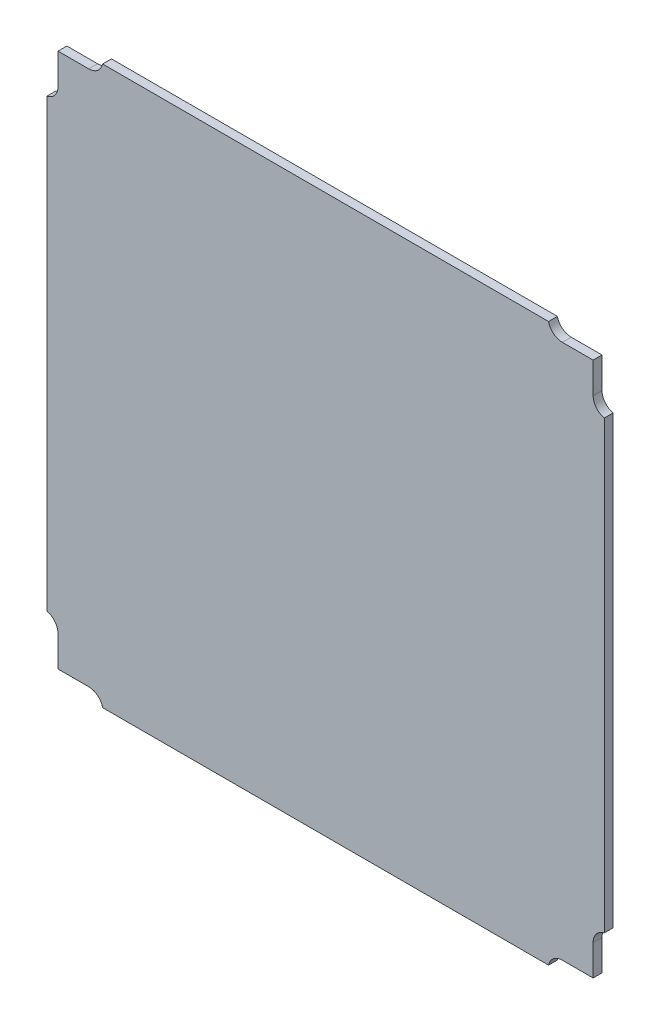
ISO-10303-21;
HEADER;
FILE_DESCRIPTION(('STEP AP214'),'2;1');
FILE_NAME('part.step','',(''),(''),'','','');
FILE_SCHEMA(('AUTOMOTIVE_DESIGN { 1 0 10303 214 1 1 1 1 }'));
ENDSEC;
DATA;
#1=APPLICATION_CONTEXT('core data for automotive mechanical design processes');
#2=APPLICATION_PROTOCOL_DEFINITION('international standard','automotive_design',2000,#1);
#3=PRODUCT_CONTEXT('',#1,'mechanical');
#4=PRODUCT('Part','Part','',(#3));
#5=PRODUCT_RELATED_PRODUCT_CATEGORY('part','',(#4));
#6=PRODUCT_DEFINITION_FORMATION('','',#4);
#7=PRODUCT_DEFINITION_CONTEXT('part definition',#1,'design');
#8=PRODUCT_DEFINITION('design','',#6,#7);
#9=PRODUCT_DEFINITION_SHAPE('','',#8);
#10=(LENGTH_UNIT() NAMED_UNIT(*) SI_UNIT(.MILLI.,.METRE.));
#11=(NAMED_UNIT(*) PLANE_ANGLE_UNIT() SI_UNIT($,.RADIAN.));
#12=(NAMED_UNIT(*) SI_UNIT($,.STERADIAN.) SOLID_ANGLE_UNIT());
#13=UNCERTAINTY_MEASURE_WITH_UNIT(LENGTH_MEASURE(1.E-05),#10,'distance_accuracy_value','');
#14=(GEOMETRIC_REPRESENTATION_CONTEXT(3) GLOBAL_UNCERTAINTY_ASSIGNED_CONTEXT((#13)) GLOBAL_UNIT_ASSIGNED_CONTEXT((#10,
#11,#12)) REPRESENTATION_CONTEXT('',''));
#15=CARTESIAN_POINT('',(0.,0.,0.));
#16=DIRECTION('',(0.,0.,1.));
#17=DIRECTION('',(1.,0.,0.));
#18=AXIS2_PLACEMENT_3D('',#15,#16,#17);
#19=CARTESIAN_POINT('',(0.,-48.0000000000001,1.5875));
#20=DIRECTION('',(0.,1.,0.));
#21=DIRECTION('',(-1.,0.,0.));
#22=AXIS2_PLACEMENT_3D('',#19,#20,#21);
#23=PLANE('',#22);
#24=DIRECTION('',(1.,0.,0.));
#25=VECTOR('',#24,1.);
#26=CARTESIAN_POINT('',(0.,-48.0000000000001,0.));
#27=LINE('',#26,#25);
#28=CARTESIAN_POINT('',(-48.,-48.,0.));
#29=VERTEX_POINT('',#28);
#30=CARTESIAN_POINT('',(-42.4819347291981,-48.,0.));
#31=VERTEX_POINT('',#30);
#32=EDGE_CURVE('E362',#29,#31,#27,.T.);
#33=ORIENTED_EDGE('',*,*,#32,.T.);
#34=DIRECTION('',(0.,0.,1.));
#35=VECTOR('',#34,1.);
#36=CARTESIAN_POINT('',(-42.4819347291981,-48.,1.5875));
#37=LINE('',#36,#35);
#38=CARTESIAN_POINT('',(-42.4819347291981,-48.,1.5875));
#39=VERTEX_POINT('',#38);
#40=EDGE_CURVE('E202',#31,#39,#37,.T.);
#41=ORIENTED_EDGE('',*,*,#40,.T.);
#42=DIRECTION('',(1.,0.,0.));
#43=VECTOR('',#42,1.);
#44=CARTESIAN_POINT('',(0.,-48.0000000000001,1.5875));
#45=LINE('',#44,#43);
#46=CARTESIAN_POINT('',(-48.,-48.,1.5875));
#47=VERTEX_POINT('',#46);
#48=EDGE_CURVE('E180',#47,#39,#45,.T.);
#49=ORIENTED_EDGE('',*,*,#48,.F.);
#50=DIRECTION('',(0.,0.,-1.));
#51=VECTOR('',#50,1.);
#52=CARTESIAN_POINT('',(-48.,-48.,1.5875));
#53=LINE('',#52,#51);
#54=EDGE_CURVE('E290',#47,#29,#53,.T.);
#55=ORIENTED_EDGE('',*,*,#54,.T.);
#56=EDGE_LOOP('',(#33,#41,#49,#55));
#57=FACE_BOUND('',#56,.T.);
#58=ADVANCED_FACE('F37',(#57),#23,.F.);
#59=CARTESIAN_POINT('',(0.,-50.,1.5875));
#60=DIRECTION('',(0.,1.,0.));
#61=DIRECTION('',(0.,0.,1.));
#62=AXIS2_PLACEMENT_3D('',#59,#60,#61);
#63=PLANE('',#62);
#64=DIRECTION('',(1.,0.,0.));
#65=VECTOR('',#64,1.);
#66=CARTESIAN_POINT('',(0.,-50.,0.));
#67=LINE('',#66,#65);
#68=CARTESIAN_POINT('',(-40.,-50.,0.));
#69=VERTEX_POINT('',#68);
#70=CARTESIAN_POINT('',(40.,-50.,0.));
#71=VERTEX_POINT('',#70);
#72=EDGE_CURVE('E331',#69,#71,#67,.T.);
#73=ORIENTED_EDGE('',*,*,#72,.T.);
#74=DIRECTION('',(0.,0.,-1.));
#75=VECTOR('',#74,1.);
#76=CARTESIAN_POINT('',(40.,-50.,1.5875));
#77=LINE('',#76,#75);
#78=CARTESIAN_POINT('',(40.,-50.,1.5875));
#79=VERTEX_POINT('',#78);
#80=EDGE_CURVE('E194',#79,#71,#77,.T.);
#81=ORIENTED_EDGE('',*,*,#80,.F.);
#82=DIRECTION('',(1.,0.,0.));
#83=VECTOR('',#82,1.);
#84=CARTESIAN_POINT('',(0.,-50.,1.5875));
#85=LINE('',#84,#83);
#86=CARTESIAN_POINT('',(-40.,-50.,1.5875));
#87=VERTEX_POINT('',#86);
#88=EDGE_CURVE('E177',#87,#79,#85,.T.);
#89=ORIENTED_EDGE('',*,*,#88,.F.);
#90=DIRECTION('',(0.,0.,-1.));
#91=VECTOR('',#90,1.);
#92=CARTESIAN_POINT('',(-40.,-50.,1.5875));
#93=LINE('',#92,#91);
#94=EDGE_CURVE('E191',#87,#69,#93,.T.);
#95=ORIENTED_EDGE('',*,*,#94,.T.);
#96=EDGE_LOOP('',(#73,#81,#89,#95));
#97=FACE_BOUND('',#96,.T.);
#98=ADVANCED_FACE('F190',(#97),#63,.F.);
#99=CARTESIAN_POINT('',(-1.2490009027033E-13,-47.9999999999999,1.5875));
#100=DIRECTION('',(0.,1.,0.));
#101=DIRECTION('',(-1.,0.,0.));
#102=AXIS2_PLACEMENT_3D('',#99,#100,#101);
#103=PLANE('',#102);
#104=DIRECTION('',(1.,0.,0.));
#105=VECTOR('',#104,1.);
#106=CARTESIAN_POINT('',(-1.2490009027033E-13,-47.9999999999999,1.5875));
#107=LINE('',#106,#105);
#108=CARTESIAN_POINT('',(42.4819347291982,-48.,1.5875));
#109=VERTEX_POINT('',#108);
#110=CARTESIAN_POINT('',(48.,-48.,1.5875));
#111=VERTEX_POINT('',#110);
#112=EDGE_CURVE('E196',#109,#111,#107,.T.);
#113=ORIENTED_EDGE('',*,*,#112,.F.);
#114=DIRECTION('',(0.,0.,-1.));
#115=VECTOR('',#114,1.);
#116=CARTESIAN_POINT('',(42.4819347291982,-48.,1.5875));
#117=LINE('',#116,#115);
#118=CARTESIAN_POINT('',(42.4819347291982,-48.,0.));
#119=VERTEX_POINT('',#118);
#120=EDGE_CURVE('E209',#109,#119,#117,.T.);
#121=ORIENTED_EDGE('',*,*,#120,.T.);
#122=DIRECTION('',(1.,0.,0.));
#123=VECTOR('',#122,1.);
#124=CARTESIAN_POINT('',(-1.2490009027033E-13,-47.9999999999999,0.));
#125=LINE('',#124,#123);
#126=CARTESIAN_POINT('',(48.,-48.,0.));
#127=VERTEX_POINT('',#126);
#128=EDGE_CURVE('E325',#119,#127,#125,.T.);
#129=ORIENTED_EDGE('',*,*,#128,.T.);
#130=DIRECTION('',(0.,0.,-1.));
#131=VECTOR('',#130,1.);
#132=CARTESIAN_POINT('',(48.,-48.,1.5875));
#133=LINE('',#132,#131);
#134=EDGE_CURVE('E204',#111,#127,#133,.T.);
#135=ORIENTED_EDGE('',*,*,#134,.F.);
#136=EDGE_LOOP('',(#113,#121,#129,#135));
#137=FACE_BOUND('',#136,.T.);
#138=ADVANCED_FACE('F367',(#137),#103,.F.);
#139=CARTESIAN_POINT('',(48.0000000000001,0.,1.5875));
#140=DIRECTION('',(-1.,0.,0.));
#141=DIRECTION('',(0.,-1.,0.));
#142=AXIS2_PLACEMENT_3D('',#139,#140,#141);
#143=PLANE('',#142);
#144=DIRECTION('',(0.,1.,0.));
#145=VECTOR('',#144,1.);
#146=CARTESIAN_POINT('',(48.0000000000001,0.,0.));
#147=LINE('',#146,#145);
#148=CARTESIAN_POINT('',(48.,-42.4819347291982,0.));
#149=VERTEX_POINT('',#148);
#150=EDGE_CURVE('E318',#127,#149,#147,.T.);
#151=ORIENTED_EDGE('',*,*,#150,.T.);
#152=DIRECTION('',(0.,0.,1.));
#153=VECTOR('',#152,1.);
#154=CARTESIAN_POINT('',(48.,-42.4819347291982,1.5875));
#155=LINE('',#154,#153);
#156=CARTESIAN_POINT('',(48.,-42.4819347291982,1.5875));
#157=VERTEX_POINT('',#156);
#158=EDGE_CURVE('E212',#149,#157,#155,.T.);
#159=ORIENTED_EDGE('',*,*,#158,.T.);
#160=DIRECTION('',(0.,1.,0.));
#161=VECTOR('',#160,1.);
#162=CARTESIAN_POINT('',(48.0000000000001,0.,1.5875));
#163=LINE('',#162,#161);
#164=EDGE_CURVE('E321',#111,#157,#163,.T.);
#165=ORIENTED_EDGE('',*,*,#164,.F.);
#166=ORIENTED_EDGE('',*,*,#134,.T.);
#167=EDGE_LOOP('',(#151,#159,#165,#166));
#168=FACE_BOUND('',#167,.T.);
#169=ADVANCED_FACE('F317',(#168),#143,.F.);
#170=CARTESIAN_POINT('',(50.,0.,1.5875));
#171=DIRECTION('',(-1.,0.,0.));
#172=DIRECTION('',(0.,0.,1.));
#173=AXIS2_PLACEMENT_3D('',#170,#171,#172);
#174=PLANE('',#173);
#175=DIRECTION('',(0.,1.,0.));
#176=VECTOR('',#175,1.);
#177=CARTESIAN_POINT('',(50.,0.,0.));
#178=LINE('',#177,#176);
#179=CARTESIAN_POINT('',(50.,-40.,0.));
#180=VERTEX_POINT('',#179);
#181=CARTESIAN_POINT('',(50.,40.,0.));
#182=VERTEX_POINT('',#181);
#183=EDGE_CURVE('E327',#180,#182,#178,.T.);
#184=ORIENTED_EDGE('',*,*,#183,.T.);
#185=DIRECTION('',(0.,0.,-1.));
#186=VECTOR('',#185,1.);
#187=CARTESIAN_POINT('',(50.,40.,1.5875));
#188=LINE('',#187,#186);
#189=CARTESIAN_POINT('',(50.,40.,1.5875));
#190=VERTEX_POINT('',#189);
#191=EDGE_CURVE('E306',#190,#182,#188,.T.);
#192=ORIENTED_EDGE('',*,*,#191,.F.);
#193=DIRECTION('',(0.,1.,0.));
#194=VECTOR('',#193,1.);
#195=CARTESIAN_POINT('',(50.,0.,1.5875));
#196=LINE('',#195,#194);
#197=CARTESIAN_POINT('',(50.,-40.,1.5875));
#198=VERTEX_POINT('',#197);
#199=EDGE_CURVE('E353',#198,#190,#196,.T.);
#200=ORIENTED_EDGE('',*,*,#199,.F.);
#201=DIRECTION('',(0.,0.,-1.));
#202=VECTOR('',#201,1.);
#203=CARTESIAN_POINT('',(50.,-40.,1.5875));
#204=LINE('',#203,#202);
#205=EDGE_CURVE('E309',#198,#180,#204,.T.);
#206=ORIENTED_EDGE('',*,*,#205,.T.);
#207=EDGE_LOOP('',(#184,#192,#200,#206));
#208=FACE_BOUND('',#207,.T.);
#209=ADVANCED_FACE('F377',(#208),#174,.F.);
#210=CARTESIAN_POINT('',(47.9999999999999,-1.2490009027033E-13,1.5875));
#211=DIRECTION('',(-1.,0.,0.));
#212=DIRECTION('',(0.,-1.,0.));
#213=AXIS2_PLACEMENT_3D('',#210,#211,#212);
#214=PLANE('',#213);
#215=DIRECTION('',(0.,1.,0.));
#216=VECTOR('',#215,1.);
#217=CARTESIAN_POINT('',(47.9999999999999,-1.2490009027033E-13,1.5875));
#218=LINE('',#217,#216);
#219=CARTESIAN_POINT('',(48.,42.4819347291982,1.5875));
#220=VERTEX_POINT('',#219);
#221=CARTESIAN_POINT('',(48.,48.,1.5875));
#222=VERTEX_POINT('',#221);
#223=EDGE_CURVE('E350',#220,#222,#218,.T.);
#224=ORIENTED_EDGE('',*,*,#223,.F.);
#225=DIRECTION('',(0.,0.,-1.));
#226=VECTOR('',#225,1.);
#227=CARTESIAN_POINT('',(48.,42.4819347291982,1.5875));
#228=LINE('',#227,#226);
#229=CARTESIAN_POINT('',(48.,42.4819347291982,0.));
#230=VERTEX_POINT('',#229);
#231=EDGE_CURVE('E214',#220,#230,#228,.T.);
#232=ORIENTED_EDGE('',*,*,#231,.T.);
#233=DIRECTION('',(0.,1.,0.));
#234=VECTOR('',#233,1.);
#235=CARTESIAN_POINT('',(47.9999999999999,-1.2490009027033E-13,0.));
#236=LINE('',#235,#234);
#237=CARTESIAN_POINT('',(48.,48.,0.));
#238=VERTEX_POINT('',#237);
#239=EDGE_CURVE('E281',#230,#238,#236,.T.);
#240=ORIENTED_EDGE('',*,*,#239,.T.);
#241=DIRECTION('',(0.,0.,-1.));
#242=VECTOR('',#241,1.);
#243=CARTESIAN_POINT('',(48.,48.,1.5875));
#244=LINE('',#243,#242);
#245=EDGE_CURVE('E303',#222,#238,#244,.T.);
#246=ORIENTED_EDGE('',*,*,#245,.F.);
#247=EDGE_LOOP('',(#224,#232,#240,#246));
#248=FACE_BOUND('',#247,.T.);
#249=ADVANCED_FACE('F338',(#248),#214,.F.);
#250=CARTESIAN_POINT('',(1.2490009027033E-13,48.0000000000001,1.5875));
#251=DIRECTION('',(0.,-1.,0.));
#252=DIRECTION('',(1.,0.,0.));
#253=AXIS2_PLACEMENT_3D('',#250,#251,#252);
#254=PLANE('',#253);
#255=DIRECTION('',(-1.,0.,0.));
#256=VECTOR('',#255,1.);
#257=CARTESIAN_POINT('',(1.2490009027033E-13,48.0000000000001,0.));
#258=LINE('',#257,#256);
#259=CARTESIAN_POINT('',(42.4819347291982,48.,0.));
#260=VERTEX_POINT('',#259);
#261=EDGE_CURVE('E276',#238,#260,#258,.T.);
#262=ORIENTED_EDGE('',*,*,#261,.T.);
#263=DIRECTION('',(0.,0.,-1.));
#264=VECTOR('',#263,1.);
#265=CARTESIAN_POINT('',(42.4819347291982,48.,1.5875));
#266=LINE('',#265,#264);
#267=CARTESIAN_POINT('',(42.4819347291982,48.,1.5875));
#268=VERTEX_POINT('',#267);
#269=EDGE_CURVE('E217',#260,#268,#266,.F.);
#270=ORIENTED_EDGE('',*,*,#269,.T.);
#271=DIRECTION('',(-1.,0.,0.));
#272=VECTOR('',#271,1.);
#273=CARTESIAN_POINT('',(1.2490009027033E-13,48.0000000000001,1.5875));
#274=LINE('',#273,#272);
#275=EDGE_CURVE('E346',#222,#268,#274,.T.);
#276=ORIENTED_EDGE('',*,*,#275,.F.);
#277=ORIENTED_EDGE('',*,*,#245,.T.);
#278=EDGE_LOOP('',(#262,#270,#276,#277));
#279=FACE_BOUND('',#278,.T.);
#280=ADVANCED_FACE('F343',(#279),#254,.F.);
#281=CARTESIAN_POINT('',(0.,50.,1.5875));
#282=DIRECTION('',(0.,1.,0.));
#283=DIRECTION('',(0.,0.,1.));
#284=AXIS2_PLACEMENT_3D('',#281,#282,#283);
#285=PLANE('',#284);
#286=DIRECTION('',(1.,0.,0.));
#287=VECTOR('',#286,1.);
#288=CARTESIAN_POINT('',(0.,50.,0.));
#289=LINE('',#288,#287);
#290=CARTESIAN_POINT('',(-40.,50.,0.));
#291=VERTEX_POINT('',#290);
#292=CARTESIAN_POINT('',(40.,50.,0.));
#293=VERTEX_POINT('',#292);
#294=EDGE_CURVE('E269',#291,#293,#289,.T.);
#295=ORIENTED_EDGE('',*,*,#294,.F.);
#296=DIRECTION('',(0.,0.,-1.));
#297=VECTOR('',#296,1.);
#298=CARTESIAN_POINT('',(-40.,50.,1.5875));
#299=LINE('',#298,#297);
#300=CARTESIAN_POINT('',(-40.,50.,1.5875));
#301=VERTEX_POINT('',#300);
#302=EDGE_CURVE('E264',#301,#291,#299,.T.);
#303=ORIENTED_EDGE('',*,*,#302,.F.);
#304=DIRECTION('',(1.,0.,0.));
#305=VECTOR('',#304,1.);
#306=CARTESIAN_POINT('',(0.,50.,1.5875));
#307=LINE('',#306,#305);
#308=CARTESIAN_POINT('',(40.,50.,1.5875));
#309=VERTEX_POINT('',#308);
#310=EDGE_CURVE('E252',#301,#309,#307,.T.);
#311=ORIENTED_EDGE('',*,*,#310,.T.);
#312=DIRECTION('',(0.,0.,-1.));
#313=VECTOR('',#312,1.);
#314=CARTESIAN_POINT('',(40.,50.,1.5875));
#315=LINE('',#314,#313);
#316=EDGE_CURVE('E275',#309,#293,#315,.T.);
#317=ORIENTED_EDGE('',*,*,#316,.T.);
#318=EDGE_LOOP('',(#295,#303,#311,#317));
#319=FACE_BOUND('',#318,.T.);
#320=ADVANCED_FACE('F273',(#319),#285,.T.);
#321=CARTESIAN_POINT('',(0.,47.9999999999999,1.5875));
#322=DIRECTION('',(0.,-1.,0.));
#323=DIRECTION('',(1.,0.,0.));
#324=AXIS2_PLACEMENT_3D('',#321,#322,#323);
#325=PLANE('',#324);
#326=DIRECTION('',(-1.,0.,0.));
#327=VECTOR('',#326,1.);
#328=CARTESIAN_POINT('',(0.,47.9999999999999,1.5875));
#329=LINE('',#328,#327);
#330=CARTESIAN_POINT('',(-42.4819347291982,48.,1.5875));
#331=VERTEX_POINT('',#330);
#332=CARTESIAN_POINT('',(-48.,48.,1.5875));
#333=VERTEX_POINT('',#332);
#334=EDGE_CURVE('E249',#331,#333,#329,.T.);
#335=ORIENTED_EDGE('',*,*,#334,.F.);
#336=DIRECTION('',(0.,0.,1.));
#337=VECTOR('',#336,1.);
#338=CARTESIAN_POINT('',(-42.4819347291982,48.,1.5875));
#339=LINE('',#338,#337);
#340=CARTESIAN_POINT('',(-42.4819347291982,48.,0.));
#341=VERTEX_POINT('',#340);
#342=EDGE_CURVE('E219',#331,#341,#339,.F.);
#343=ORIENTED_EDGE('',*,*,#342,.T.);
#344=DIRECTION('',(-1.,0.,0.));
#345=VECTOR('',#344,1.);
#346=CARTESIAN_POINT('',(0.,47.9999999999999,0.));
#347=LINE('',#346,#345);
#348=CARTESIAN_POINT('',(-48.,48.,0.));
#349=VERTEX_POINT('',#348);
#350=EDGE_CURVE('E270',#341,#349,#347,.T.);
#351=ORIENTED_EDGE('',*,*,#350,.T.);
#352=DIRECTION('',(0.,0.,-1.));
#353=VECTOR('',#352,1.);
#354=CARTESIAN_POINT('',(-48.,48.,1.5875));
#355=LINE('',#354,#353);
#356=EDGE_CURVE('E260',#333,#349,#355,.T.);
#357=ORIENTED_EDGE('',*,*,#356,.F.);
#358=EDGE_LOOP('',(#335,#343,#351,#357));
#359=FACE_BOUND('',#358,.T.);
#360=ADVANCED_FACE('F257',(#359),#325,.F.);
#361=CARTESIAN_POINT('',(-48.0000000000001,0.,1.5875));
#362=DIRECTION('',(1.,0.,0.));
#363=DIRECTION('',(0.,1.,0.));
#364=AXIS2_PLACEMENT_3D('',#361,#362,#363);
#365=PLANE('',#364);
#366=DIRECTION('',(0.,-1.,0.));
#367=VECTOR('',#366,1.);
#368=CARTESIAN_POINT('',(-48.0000000000001,0.,0.));
#369=LINE('',#368,#367);
#370=CARTESIAN_POINT('',(-48.,42.4819347291981,0.));
#371=VERTEX_POINT('',#370);
#372=EDGE_CURVE('E278',#349,#371,#369,.T.);
#373=ORIENTED_EDGE('',*,*,#372,.T.);
#374=DIRECTION('',(0.,0.,-1.));
#375=VECTOR('',#374,1.);
#376=CARTESIAN_POINT('',(-48.,42.4819347291981,1.5875));
#377=LINE('',#376,#375);
#378=CARTESIAN_POINT('',(-48.,42.4819347291981,1.5875));
#379=VERTEX_POINT('',#378);
#380=EDGE_CURVE('E52',#371,#379,#377,.F.);
#381=ORIENTED_EDGE('',*,*,#380,.T.);
#382=DIRECTION('',(0.,-1.,0.));
#383=VECTOR('',#382,1.);
#384=CARTESIAN_POINT('',(-48.0000000000001,0.,1.5875));
#385=LINE('',#384,#383);
#386=EDGE_CURVE('E261',#333,#379,#385,.T.);
#387=ORIENTED_EDGE('',*,*,#386,.F.);
#388=ORIENTED_EDGE('',*,*,#356,.T.);
#389=EDGE_LOOP('',(#373,#381,#387,#388));
#390=FACE_BOUND('',#389,.T.);
#391=ADVANCED_FACE('F463',(#390),#365,.F.);
#392=CARTESIAN_POINT('',(-50.,0.,1.5875));
#393=DIRECTION('',(-1.,0.,0.));
#394=DIRECTION('',(0.,0.,1.));
#395=AXIS2_PLACEMENT_3D('',#392,#393,#394);
#396=PLANE('',#395);
#397=DIRECTION('',(0.,1.,0.));
#398=VECTOR('',#397,1.);
#399=CARTESIAN_POINT('',(-50.,0.,0.));
#400=LINE('',#399,#398);
#401=CARTESIAN_POINT('',(-50.,-40.,0.));
#402=VERTEX_POINT('',#401);
#403=CARTESIAN_POINT('',(-50.,40.,0.));
#404=VERTEX_POINT('',#403);
#405=EDGE_CURVE('E286',#402,#404,#400,.T.);
#406=ORIENTED_EDGE('',*,*,#405,.F.);
#407=DIRECTION('',(0.,0.,-1.));
#408=VECTOR('',#407,1.);
#409=CARTESIAN_POINT('',(-50.,-40.,1.5875));
#410=LINE('',#409,#408);
#411=CARTESIAN_POINT('',(-50.,-40.,1.5875));
#412=VERTEX_POINT('',#411);
#413=EDGE_CURVE('E293',#412,#402,#410,.T.);
#414=ORIENTED_EDGE('',*,*,#413,.F.);
#415=DIRECTION('',(0.,1.,0.));
#416=VECTOR('',#415,1.);
#417=CARTESIAN_POINT('',(-50.,0.,1.5875));
#418=LINE('',#417,#416);
#419=CARTESIAN_POINT('',(-50.,40.,1.5875));
#420=VERTEX_POINT('',#419);
#421=EDGE_CURVE('E358',#412,#420,#418,.T.);
#422=ORIENTED_EDGE('',*,*,#421,.T.);
#423=DIRECTION('',(0.,0.,-1.));
#424=VECTOR('',#423,1.);
#425=CARTESIAN_POINT('',(-50.,40.,1.5875));
#426=LINE('',#425,#424);
#427=EDGE_CURVE('E297',#420,#404,#426,.T.);
#428=ORIENTED_EDGE('',*,*,#427,.T.);
#429=EDGE_LOOP('',(#406,#414,#422,#428));
#430=FACE_BOUND('',#429,.T.);
#431=ADVANCED_FACE('F449',(#430),#396,.T.);
#432=CARTESIAN_POINT('',(-47.9999999999999,0.,1.5875));
#433=DIRECTION('',(1.,0.,0.));
#434=DIRECTION('',(0.,1.,0.));
#435=AXIS2_PLACEMENT_3D('',#432,#433,#434);
#436=PLANE('',#435);
#437=DIRECTION('',(0.,-1.,0.));
#438=VECTOR('',#437,1.);
#439=CARTESIAN_POINT('',(-47.9999999999999,0.,1.5875));
#440=LINE('',#439,#438);
#441=CARTESIAN_POINT('',(-48.,-42.4819347291982,1.5875));
#442=VERTEX_POINT('',#441);
#443=EDGE_CURVE('E294',#442,#47,#440,.T.);
#444=ORIENTED_EDGE('',*,*,#443,.F.);
#445=DIRECTION('',(0.,0.,1.));
#446=VECTOR('',#445,1.);
#447=CARTESIAN_POINT('',(-48.,-42.4819347291982,1.5875));
#448=LINE('',#447,#446);
#449=CARTESIAN_POINT('',(-48.,-42.4819347291982,0.));
#450=VERTEX_POINT('',#449);
#451=EDGE_CURVE('E199',#442,#450,#448,.F.);
#452=ORIENTED_EDGE('',*,*,#451,.T.);
#453=DIRECTION('',(0.,-1.,0.));
#454=VECTOR('',#453,1.);
#455=CARTESIAN_POINT('',(-47.9999999999999,0.,0.));
#456=LINE('',#455,#454);
#457=EDGE_CURVE('E288',#450,#29,#456,.T.);
#458=ORIENTED_EDGE('',*,*,#457,.T.);
#459=ORIENTED_EDGE('',*,*,#54,.F.);
#460=EDGE_LOOP('',(#444,#452,#458,#459));
#461=FACE_BOUND('',#460,.T.);
#462=ADVANCED_FACE('F454',(#461),#436,.F.);
#463=CARTESIAN_POINT('',(0.,0.,1.5875));
#464=DIRECTION('',(0.,0.,1.));
#465=DIRECTION('',(1.,0.,0.));
#466=AXIS2_PLACEMENT_3D('',#463,#464,#465);
#467=PLANE('',#466);
#468=ORIENTED_EDGE('',*,*,#48,.T.);
#469=CARTESIAN_POINT('',(-42.4819347291981,-50.54,1.5875));
#470=DIRECTION('',(0.,0.,1.));
#471=DIRECTION('',(1.,0.,0.));
#472=AXIS2_PLACEMENT_3D('',#469,#470,#471);
#473=CIRCLE('',#472,2.54);
#474=EDGE_CURVE('E174',#39,#87,#473,.F.);
#475=ORIENTED_EDGE('',*,*,#474,.T.);
#476=ORIENTED_EDGE('',*,*,#88,.T.);
#477=CARTESIAN_POINT('',(42.4819347291982,-50.54,1.5875));
#478=DIRECTION('',(0.,0.,1.));
#479=DIRECTION('',(1.,0.,0.));
#480=AXIS2_PLACEMENT_3D('',#477,#478,#479);
#481=CIRCLE('',#480,2.54);
#482=EDGE_CURVE('E229',#79,#109,#481,.F.);
#483=ORIENTED_EDGE('',*,*,#482,.T.);
#484=ORIENTED_EDGE('',*,*,#112,.T.);
#485=ORIENTED_EDGE('',*,*,#164,.T.);
#486=CARTESIAN_POINT('',(50.54,-42.4819347291982,1.5875));
#487=DIRECTION('',(0.,0.,1.));
#488=DIRECTION('',(1.,0.,0.));
#489=AXIS2_PLACEMENT_3D('',#486,#487,#488);
#490=CIRCLE('',#489,2.54);
#491=EDGE_CURVE('E233',#157,#198,#490,.F.);
#492=ORIENTED_EDGE('',*,*,#491,.T.);
#493=ORIENTED_EDGE('',*,*,#199,.T.);
#494=CARTESIAN_POINT('',(50.54,42.4819347291981,1.5875));
#495=DIRECTION('',(0.,0.,1.));
#496=DIRECTION('',(1.,0.,0.));
#497=AXIS2_PLACEMENT_3D('',#494,#495,#496);
#498=CIRCLE('',#497,2.54);
#499=EDGE_CURVE('E237',#190,#220,#498,.F.);
#500=ORIENTED_EDGE('',*,*,#499,.T.);
#501=ORIENTED_EDGE('',*,*,#223,.T.);
#502=ORIENTED_EDGE('',*,*,#275,.T.);
#503=CARTESIAN_POINT('',(42.4819347291982,50.54,1.5875));
#504=DIRECTION('',(0.,0.,1.));
#505=DIRECTION('',(1.,0.,0.));
#506=AXIS2_PLACEMENT_3D('',#503,#504,#505);
#507=CIRCLE('',#506,2.54);
#508=EDGE_CURVE('E241',#268,#309,#507,.F.);
#509=ORIENTED_EDGE('',*,*,#508,.T.);
#510=ORIENTED_EDGE('',*,*,#310,.F.);
#511=CARTESIAN_POINT('',(-42.4819347291982,50.54,1.5875));
#512=DIRECTION('',(0.,0.,1.));
#513=DIRECTION('',(1.,0.,0.));
#514=AXIS2_PLACEMENT_3D('',#511,#512,#513);
#515=CIRCLE('',#514,2.54);
#516=EDGE_CURVE('E245',#301,#331,#515,.F.);
#517=ORIENTED_EDGE('',*,*,#516,.T.);
#518=ORIENTED_EDGE('',*,*,#334,.T.);
#519=ORIENTED_EDGE('',*,*,#386,.T.);
#520=CARTESIAN_POINT('',(-50.54,42.4819347291982,1.5875));
#521=DIRECTION('',(0.,0.,1.));
#522=DIRECTION('',(1.,0.,0.));
#523=AXIS2_PLACEMENT_3D('',#520,#521,#522);
#524=CIRCLE('',#523,2.54);
#525=EDGE_CURVE('E11',#379,#420,#524,.F.);
#526=ORIENTED_EDGE('',*,*,#525,.T.);
#527=ORIENTED_EDGE('',*,*,#421,.F.);
#528=CARTESIAN_POINT('',(-50.54,-42.4819347291982,1.5875));
#529=DIRECTION('',(0.,0.,1.));
#530=DIRECTION('',(1.,0.,0.));
#531=AXIS2_PLACEMENT_3D('',#528,#529,#530);
#532=CIRCLE('',#531,2.54);
#533=EDGE_CURVE('E225',#412,#442,#532,.F.);
#534=ORIENTED_EDGE('',*,*,#533,.T.);
#535=ORIENTED_EDGE('',*,*,#443,.T.);
#536=EDGE_LOOP('',(#468,#475,#476,#483,#484,#485,#492,#493,#500,#501,#502,#509,#510,#517,#518,
#519,#526,#527,#534,#535));
#537=FACE_BOUND('',#536,.T.);
#538=ADVANCED_FACE('F176',(#537),#467,.T.);
#539=CARTESIAN_POINT('',(0.,0.,0.));
#540=DIRECTION('',(0.,0.,1.));
#541=DIRECTION('',(1.,0.,0.));
#542=AXIS2_PLACEMENT_3D('',#539,#540,#541);
#543=PLANE('',#542);
#544=ORIENTED_EDGE('',*,*,#32,.F.);
#545=ORIENTED_EDGE('',*,*,#457,.F.);
#546=CARTESIAN_POINT('',(-50.54,-42.4819347291982,0.));
#547=DIRECTION('',(0.,0.,1.));
#548=DIRECTION('',(1.,0.,0.));
#549=AXIS2_PLACEMENT_3D('',#546,#547,#548);
#550=CIRCLE('',#549,2.54);
#551=EDGE_CURVE('E223',#450,#402,#550,.T.);
#552=ORIENTED_EDGE('',*,*,#551,.T.);
#553=ORIENTED_EDGE('',*,*,#405,.T.);
#554=CARTESIAN_POINT('',(-50.54,42.4819347291982,0.));
#555=DIRECTION('',(0.,0.,1.));
#556=DIRECTION('',(1.,0.,0.));
#557=AXIS2_PLACEMENT_3D('',#554,#555,#556);
#558=CIRCLE('',#557,2.54);
#559=EDGE_CURVE('E45',#404,#371,#558,.T.);
#560=ORIENTED_EDGE('',*,*,#559,.T.);
#561=ORIENTED_EDGE('',*,*,#372,.F.);
#562=ORIENTED_EDGE('',*,*,#350,.F.);
#563=CARTESIAN_POINT('',(-42.4819347291982,50.54,0.));
#564=DIRECTION('',(0.,0.,1.));
#565=DIRECTION('',(1.,0.,0.));
#566=AXIS2_PLACEMENT_3D('',#563,#564,#565);
#567=CIRCLE('',#566,2.54);
#568=EDGE_CURVE('E243',#341,#291,#567,.T.);
#569=ORIENTED_EDGE('',*,*,#568,.T.);
#570=ORIENTED_EDGE('',*,*,#294,.T.);
#571=CARTESIAN_POINT('',(42.4819347291982,50.54,0.));
#572=DIRECTION('',(0.,0.,1.));
#573=DIRECTION('',(1.,0.,0.));
#574=AXIS2_PLACEMENT_3D('',#571,#572,#573);
#575=CIRCLE('',#574,2.54);
#576=EDGE_CURVE('E239',#293,#260,#575,.T.);
#577=ORIENTED_EDGE('',*,*,#576,.T.);
#578=ORIENTED_EDGE('',*,*,#261,.F.);
#579=ORIENTED_EDGE('',*,*,#239,.F.);
#580=CARTESIAN_POINT('',(50.54,42.4819347291981,0.));
#581=DIRECTION('',(0.,0.,1.));
#582=DIRECTION('',(1.,0.,0.));
#583=AXIS2_PLACEMENT_3D('',#580,#581,#582);
#584=CIRCLE('',#583,2.54);
#585=EDGE_CURVE('E235',#230,#182,#584,.T.);
#586=ORIENTED_EDGE('',*,*,#585,.T.);
#587=ORIENTED_EDGE('',*,*,#183,.F.);
#588=CARTESIAN_POINT('',(50.54,-42.4819347291982,0.));
#589=DIRECTION('',(0.,0.,1.));
#590=DIRECTION('',(1.,0.,0.));
#591=AXIS2_PLACEMENT_3D('',#588,#589,#590);
#592=CIRCLE('',#591,2.54);
#593=EDGE_CURVE('E231',#180,#149,#592,.T.);
#594=ORIENTED_EDGE('',*,*,#593,.T.);
#595=ORIENTED_EDGE('',*,*,#150,.F.);
#596=ORIENTED_EDGE('',*,*,#128,.F.);
#597=CARTESIAN_POINT('',(42.4819347291982,-50.54,0.));
#598=DIRECTION('',(0.,0.,1.));
#599=DIRECTION('',(1.,0.,0.));
#600=AXIS2_PLACEMENT_3D('',#597,#598,#599);
#601=CIRCLE('',#600,2.54);
#602=EDGE_CURVE('E184',#119,#71,#601,.T.);
#603=ORIENTED_EDGE('',*,*,#602,.T.);
#604=ORIENTED_EDGE('',*,*,#72,.F.);
#605=CARTESIAN_POINT('',(-42.4819347291981,-50.54,0.));
#606=DIRECTION('',(0.,0.,1.));
#607=DIRECTION('',(1.,0.,0.));
#608=AXIS2_PLACEMENT_3D('',#605,#606,#607);
#609=CIRCLE('',#608,2.54);
#610=EDGE_CURVE('E185',#69,#31,#609,.T.);
#611=ORIENTED_EDGE('',*,*,#610,.T.);
#612=EDGE_LOOP('',(#544,#545,#552,#553,#560,#561,#562,#569,#570,#577,#578,#579,#586,#587,#594,
#595,#596,#603,#604,#611));
#613=FACE_BOUND('',#612,.T.);
#614=ADVANCED_FACE('F268',(#613),#543,.F.);
#615=CARTESIAN_POINT('',(-50.54,-42.4819347291982,1.5875));
#616=DIRECTION('',(0.,0.,1.));
#617=DIRECTION('',(1.,0.,0.));
#618=AXIS2_PLACEMENT_3D('',#615,#616,#617);
#619=CYLINDRICAL_SURFACE('',#618,2.54);
#620=ORIENTED_EDGE('',*,*,#533,.F.);
#621=ORIENTED_EDGE('',*,*,#413,.T.);
#622=ORIENTED_EDGE('',*,*,#551,.F.);
#623=ORIENTED_EDGE('',*,*,#451,.F.);
#624=EDGE_LOOP('',(#620,#621,#622,#623));
#625=FACE_BOUND('',#624,.T.);
#626=ADVANCED_FACE('F399',(#625),#619,.F.);
#627=CARTESIAN_POINT('',(-42.4819347291981,-50.54,1.5875));
#628=DIRECTION('',(0.,0.,1.));
#629=DIRECTION('',(1.,0.,0.));
#630=AXIS2_PLACEMENT_3D('',#627,#628,#629);
#631=CYLINDRICAL_SURFACE('',#630,2.54);
#632=ORIENTED_EDGE('',*,*,#474,.F.);
#633=ORIENTED_EDGE('',*,*,#40,.F.);
#634=ORIENTED_EDGE('',*,*,#610,.F.);
#635=ORIENTED_EDGE('',*,*,#94,.F.);
#636=EDGE_LOOP('',(#632,#633,#634,#635));
#637=FACE_BOUND('',#636,.T.);
#638=ADVANCED_FACE('F198',(#637),#631,.F.);
#639=CARTESIAN_POINT('',(42.4819347291982,-50.54,1.5875));
#640=DIRECTION('',(0.,0.,-1.));
#641=DIRECTION('',(-1.,0.,0.));
#642=AXIS2_PLACEMENT_3D('',#639,#640,#641);
#643=CYLINDRICAL_SURFACE('',#642,2.54);
#644=ORIENTED_EDGE('',*,*,#482,.F.);
#645=ORIENTED_EDGE('',*,*,#80,.T.);
#646=ORIENTED_EDGE('',*,*,#602,.F.);
#647=ORIENTED_EDGE('',*,*,#120,.F.);
#648=EDGE_LOOP('',(#644,#645,#646,#647));
#649=FACE_BOUND('',#648,.T.);
#650=ADVANCED_FACE('F365',(#649),#643,.F.);
#651=CARTESIAN_POINT('',(50.54,-42.4819347291982,1.5875));
#652=DIRECTION('',(0.,0.,1.));
#653=DIRECTION('',(1.,0.,0.));
#654=AXIS2_PLACEMENT_3D('',#651,#652,#653);
#655=CYLINDRICAL_SURFACE('',#654,2.54);
#656=ORIENTED_EDGE('',*,*,#491,.F.);
#657=ORIENTED_EDGE('',*,*,#158,.F.);
#658=ORIENTED_EDGE('',*,*,#593,.F.);
#659=ORIENTED_EDGE('',*,*,#205,.F.);
#660=EDGE_LOOP('',(#656,#657,#658,#659));
#661=FACE_BOUND('',#660,.T.);
#662=ADVANCED_FACE('F381',(#661),#655,.F.);
#663=CARTESIAN_POINT('',(50.54,42.4819347291981,1.5875));
#664=DIRECTION('',(0.,0.,-1.));
#665=DIRECTION('',(-1.,0.,0.));
#666=AXIS2_PLACEMENT_3D('',#663,#664,#665);
#667=CYLINDRICAL_SURFACE('',#666,2.54);
#668=ORIENTED_EDGE('',*,*,#499,.F.);
#669=ORIENTED_EDGE('',*,*,#191,.T.);
#670=ORIENTED_EDGE('',*,*,#585,.F.);
#671=ORIENTED_EDGE('',*,*,#231,.F.);
#672=EDGE_LOOP('',(#668,#669,#670,#671));
#673=FACE_BOUND('',#672,.T.);
#674=ADVANCED_FACE('F379',(#673),#667,.F.);
#675=CARTESIAN_POINT('',(42.4819347291982,50.54,1.5875));
#676=DIRECTION('',(0.,0.,-1.));
#677=DIRECTION('',(-1.,0.,0.));
#678=AXIS2_PLACEMENT_3D('',#675,#676,#677);
#679=CYLINDRICAL_SURFACE('',#678,2.54);
#680=ORIENTED_EDGE('',*,*,#508,.F.);
#681=ORIENTED_EDGE('',*,*,#269,.F.);
#682=ORIENTED_EDGE('',*,*,#576,.F.);
#683=ORIENTED_EDGE('',*,*,#316,.F.);
#684=EDGE_LOOP('',(#680,#681,#682,#683));
#685=FACE_BOUND('',#684,.T.);
#686=ADVANCED_FACE('F349',(#685),#679,.F.);
#687=CARTESIAN_POINT('',(-42.4819347291982,50.54,1.5875));
#688=DIRECTION('',(0.,0.,1.));
#689=DIRECTION('',(1.,0.,0.));
#690=AXIS2_PLACEMENT_3D('',#687,#688,#689);
#691=CYLINDRICAL_SURFACE('',#690,2.54);
#692=ORIENTED_EDGE('',*,*,#516,.F.);
#693=ORIENTED_EDGE('',*,*,#302,.T.);
#694=ORIENTED_EDGE('',*,*,#568,.F.);
#695=ORIENTED_EDGE('',*,*,#342,.F.);
#696=EDGE_LOOP('',(#692,#693,#694,#695));
#697=FACE_BOUND('',#696,.T.);
#698=ADVANCED_FACE('F263',(#697),#691,.F.);
#699=CARTESIAN_POINT('',(-50.54,42.4819347291982,1.5875));
#700=DIRECTION('',(0.,0.,-1.));
#701=DIRECTION('',(-1.,0.,0.));
#702=AXIS2_PLACEMENT_3D('',#699,#700,#701);
#703=CYLINDRICAL_SURFACE('',#702,2.54);
#704=ORIENTED_EDGE('',*,*,#525,.F.);
#705=ORIENTED_EDGE('',*,*,#380,.F.);
#706=ORIENTED_EDGE('',*,*,#559,.F.);
#707=ORIENTED_EDGE('',*,*,#427,.F.);
#708=EDGE_LOOP('',(#704,#705,#706,#707));
#709=FACE_BOUND('',#708,.T.);
#710=ADVANCED_FACE('F39',(#709),#703,.F.);
#711=CLOSED_SHELL('',(#58,#98,#138,#169,#209,#249,#280,#320,#360,#391,#431,#462,#538,#614,#626,
#638,#650,#662,#674,#686,#698,#710));
#712=MANIFOLD_SOLID_BREP('B2',#711);
#713=ADVANCED_BREP_SHAPE_REPRESENTATION('',(#18,#712),#14);
#714=SHAPE_DEFINITION_REPRESENTATION(#9,#713);
ENDSEC;
END-ISO-10303-21;
